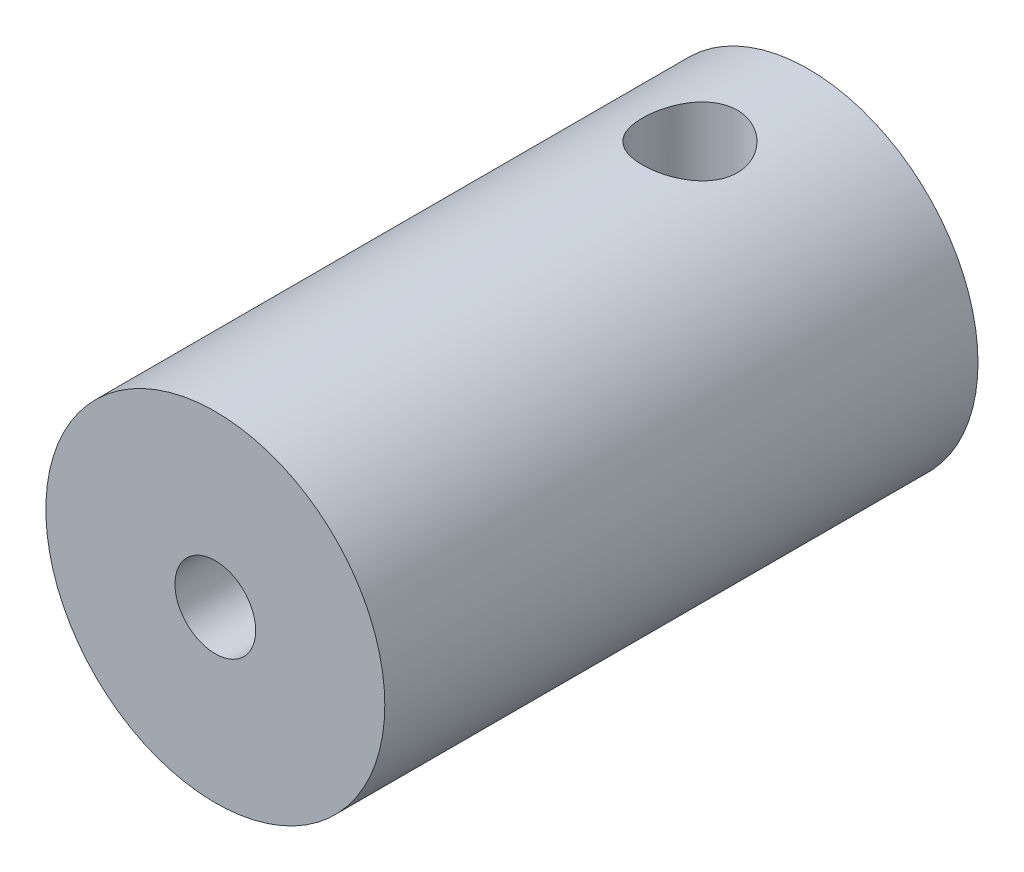
ISO-10303-21;
HEADER;
FILE_DESCRIPTION(('STEP AP214'),'2;1');
FILE_NAME('part.step','',(''),(''),'','','');
FILE_SCHEMA(('AUTOMOTIVE_DESIGN { 1 0 10303 214 1 1 1 1 }'));
ENDSEC;
DATA;
#1=APPLICATION_CONTEXT('core data for automotive mechanical design processes');
#2=APPLICATION_PROTOCOL_DEFINITION('international standard','automotive_design',2000,#1);
#3=PRODUCT_CONTEXT('',#1,'mechanical');
#4=PRODUCT('Part','Part','',(#3));
#5=PRODUCT_RELATED_PRODUCT_CATEGORY('part','',(#4));
#6=PRODUCT_DEFINITION_FORMATION('','',#4);
#7=PRODUCT_DEFINITION_CONTEXT('part definition',#1,'design');
#8=PRODUCT_DEFINITION('design','',#6,#7);
#9=PRODUCT_DEFINITION_SHAPE('','',#8);
#10=(LENGTH_UNIT() NAMED_UNIT(*) SI_UNIT(.MILLI.,.METRE.));
#11=(NAMED_UNIT(*) PLANE_ANGLE_UNIT() SI_UNIT($,.RADIAN.));
#12=(NAMED_UNIT(*) SI_UNIT($,.STERADIAN.) SOLID_ANGLE_UNIT());
#13=UNCERTAINTY_MEASURE_WITH_UNIT(LENGTH_MEASURE(1.E-05),#10,'distance_accuracy_value','');
#14=(GEOMETRIC_REPRESENTATION_CONTEXT(3) GLOBAL_UNCERTAINTY_ASSIGNED_CONTEXT((#13)) GLOBAL_UNIT_ASSIGNED_CONTEXT((#10,
#11,#12)) REPRESENTATION_CONTEXT('',''));
#15=CARTESIAN_POINT('',(0.,0.,0.));
#16=DIRECTION('',(0.,0.,1.));
#17=DIRECTION('',(1.,0.,0.));
#18=AXIS2_PLACEMENT_3D('',#15,#16,#17);
#19=CARTESIAN_POINT('',(0.,0.,35.));
#20=DIRECTION('',(0.,0.,-1.));
#21=DIRECTION('',(-1.,0.,0.));
#22=AXIS2_PLACEMENT_3D('',#19,#20,#21);
#23=CYLINDRICAL_SURFACE('',#22,10.);
#24=CARTESIAN_POINT('',(0.,0.,35.));
#25=DIRECTION('',(0.,0.,1.));
#26=DIRECTION('',(1.,0.,0.));
#27=AXIS2_PLACEMENT_3D('',#24,#25,#26);
#28=CIRCLE('',#27,10.);
#29=CARTESIAN_POINT('',(10.,0.,35.));
#30=VERTEX_POINT('',#29);
#31=EDGE_CURVE('E10',#30,#30,#28,.T.);
#32=ORIENTED_EDGE('',*,*,#31,.F.);
#33=EDGE_LOOP('',(#32));
#34=FACE_BOUND('',#33,.T.);
#35=CARTESIAN_POINT('',(0.,0.,0.));
#36=DIRECTION('',(0.,0.,1.));
#37=DIRECTION('',(1.,0.,0.));
#38=AXIS2_PLACEMENT_3D('',#35,#36,#37);
#39=CIRCLE('',#38,10.);
#40=CARTESIAN_POINT('',(10.,0.,0.));
#41=VERTEX_POINT('',#40);
#42=EDGE_CURVE('E44',#41,#41,#39,.T.);
#43=ORIENTED_EDGE('',*,*,#42,.T.);
#44=EDGE_LOOP('',(#43));
#45=FACE_BOUND('',#44,.T.);
#46=CARTESIAN_POINT('',(0.,10.,4.2));
#47=CARTESIAN_POINT('',(-0.154065429145943,9.99999800059393,4.2000030212422));
#48=CARTESIAN_POINT('',(-0.308162273480088,9.99640491810827,4.2127582688197));
#49=CARTESIAN_POINT('',(-0.611897994179671,9.98242110182319,4.2633401101412));
#50=CARTESIAN_POINT('',(-0.761535017440555,9.97202758242962,4.30117697789887));
#51=CARTESIAN_POINT('',(-1.05192431759401,9.94558686401861,4.40058130651125));
#52=CARTESIAN_POINT('',(-1.19268839590718,9.92954736983413,4.46211643801771));
#53=CARTESIAN_POINT('',(-1.46189968721869,9.893498867188,4.60704569090036));
#54=CARTESIAN_POINT('',(-1.59034575050753,9.8734894887286,4.69044184998216));
#55=CARTESIAN_POINT('',(-1.83453015519062,9.83108443801059,4.87895581158683));
#56=CARTESIAN_POINT('',(-1.94991193977893,9.80864475601135,4.98452556254727));
#57=CARTESIAN_POINT('',(-2.16158659967106,9.76418283149685,5.21342502148276));
#58=CARTESIAN_POINT('',(-2.25787674126981,9.74216064917047,5.3367572684857));
#59=CARTESIAN_POINT('',(-2.43042605891346,9.70057117196296,5.60059265089508));
#60=CARTESIAN_POINT('',(-2.50626541586478,9.68105909136695,5.74137985967721));
#61=CARTESIAN_POINT('',(-2.63305257665218,9.64735032587816,6.03434259979042));
#62=CARTESIAN_POINT('',(-2.6840054980816,9.6331525483039,6.18651578230571));
#63=CARTESIAN_POINT('',(-2.75831670498487,9.6121359460678,6.49395977138305));
#64=CARTESIAN_POINT('',(-2.78232578099845,9.60514344626391,6.64906110498407));
#65=CARTESIAN_POINT('',(-2.80409806651587,9.59881105772509,6.96123567419772));
#66=CARTESIAN_POINT('',(-2.8018667304816,9.5994695786108,7.11830849322694));
#67=CARTESIAN_POINT('',(-2.77173604959393,9.60820996637126,7.42480741493447));
#68=CARTESIAN_POINT('',(-2.74463468496829,9.61606103976332,7.57431960849052));
#69=CARTESIAN_POINT('',(-2.66681565074885,9.63793089210428,7.86658471349627));
#70=CARTESIAN_POINT('',(-2.61609592196964,9.65195020883037,8.00933703438542));
#71=CARTESIAN_POINT('',(-2.49185421192272,9.68477250963813,8.28606030645843));
#72=CARTESIAN_POINT('',(-2.41806066638955,9.70363195852586,8.41990235076579));
#73=CARTESIAN_POINT('',(-2.24995518133247,9.74398044101338,8.67357919110111));
#74=CARTESIAN_POINT('',(-2.15563883413612,9.76547003905462,8.79341096963866));
#75=CARTESIAN_POINT('',(-1.945130070486,9.80960868726074,9.02021252316115));
#76=CARTESIAN_POINT('',(-1.82827049780276,9.83227157921973,9.12656132230944));
#77=CARTESIAN_POINT('',(-1.57809559669089,9.87551038706931,9.31828626003981));
#78=CARTESIAN_POINT('',(-1.44477948172922,9.89608620312336,9.40366139561149));
#79=CARTESIAN_POINT('',(-1.1644499337768,9.93298140267101,9.55132825584314));
#80=CARTESIAN_POINT('',(-1.01736897822638,9.94927813215491,9.61349783024306));
#81=CARTESIAN_POINT('',(-0.714280244959805,9.97561561888343,9.71204354832863));
#82=CARTESIAN_POINT('',(-0.558274634899474,9.98565788825178,9.748425926808));
#83=CARTESIAN_POINT('',(-0.247056535331409,9.99812219608934,9.79336683078308));
#84=CARTESIAN_POINT('',(-0.0919748653162632,10.0007750839573,9.80276854472296));
#85=CARTESIAN_POINT('',(0.217552852424549,9.9988306664298,9.79582325772551));
#86=CARTESIAN_POINT('',(0.37199897110296,9.99423419364951,9.77947921378109));
#87=CARTESIAN_POINT('',(0.672795024976543,9.97845749111538,9.72219453001657));
#88=CARTESIAN_POINT('',(0.819243531299092,9.96740554981394,9.68173286344975));
#89=CARTESIAN_POINT('',(1.10325343945893,9.9399801500939,9.57792543335633));
#90=CARTESIAN_POINT('',(1.24081382962005,9.92360608716766,9.51457707017692));
#91=CARTESIAN_POINT('',(1.50635211550847,9.88682267587594,9.3652886467026));
#92=CARTESIAN_POINT('',(1.63406753404635,9.86633568099167,9.27890134426308));
#93=CARTESIAN_POINT('',(1.87348211388076,9.82368959784004,9.08654198621789));
#94=CARTESIAN_POINT('',(1.98517776842875,9.80153014508466,8.98056565413147));
#95=CARTESIAN_POINT('',(2.19299877746055,9.75717259135678,8.74808872546741));
#96=CARTESIAN_POINT('',(2.28852691021664,9.73499501664591,8.62104926995609));
#97=CARTESIAN_POINT('',(2.45693306834241,9.69386520723045,8.35226699177442));
#98=CARTESIAN_POINT('',(2.52981194004495,9.67491285202136,8.21052471876694));
#99=CARTESIAN_POINT('',(2.65031136361148,9.64260050746764,7.91699106844506));
#100=CARTESIAN_POINT('',(2.69807050435179,9.62920992117953,7.76526013881482));
#101=CARTESIAN_POINT('',(2.76725693285146,9.60955812642637,7.45547571023357));
#102=CARTESIAN_POINT('',(2.78869180791185,9.60329486372953,7.29742404664133));
#103=CARTESIAN_POINT('',(2.80415287354236,9.59879067310822,6.98563248418183));
#104=CARTESIAN_POINT('',(2.79914395120439,9.60026731543518,6.83194383242856));
#105=CARTESIAN_POINT('',(2.76412298746076,9.61040838766261,6.52769613663361));
#106=CARTESIAN_POINT('',(2.73411171950601,9.61907259521476,6.37713699592775));
#107=CARTESIAN_POINT('',(2.65052304211041,9.64243588913118,6.08477640847671));
#108=CARTESIAN_POINT('',(2.59716983425416,9.65707747485842,5.94290593592202));
#109=CARTESIAN_POINT('',(2.46858515169321,9.69074220682432,5.67001919603522));
#110=CARTESIAN_POINT('',(2.39334993497019,9.70976610236115,5.53900479011505));
#111=CARTESIAN_POINT('',(2.22029618025219,9.75081652103138,5.28699254425231));
#112=CARTESIAN_POINT('',(2.12182874405365,9.77291997619129,5.1664527896915));
#113=CARTESIAN_POINT('',(1.9063140615188,9.81723228272495,4.9432945782957));
#114=CARTESIAN_POINT('',(1.78926219581492,9.83944115896734,4.84068059046402));
#115=CARTESIAN_POINT('',(1.53646884760777,9.88210851159388,4.65381976071206));
#116=CARTESIAN_POINT('',(1.40034211759354,9.90251129390519,4.57008020629512));
#117=CARTESIAN_POINT('',(1.1153725237224,9.93863736051014,4.42680277778135));
#118=CARTESIAN_POINT('',(0.966537045967038,9.9543633393733,4.36725096050618));
#119=CARTESIAN_POINT('',(0.682104363429536,9.97758196529894,4.28088134576072));
#120=CARTESIAN_POINT('',(0.547611032656707,9.98592437500941,4.25062565920966));
#121=CARTESIAN_POINT('',(0.275419906644087,9.9971339513614,4.21018486269848));
#122=CARTESIAN_POINT('',(0.137722505211398,10.0000017873134,4.19999729924457));
#123=CARTESIAN_POINT('',(0.,10.,4.2));
#124=B_SPLINE_CURVE_WITH_KNOTS('',3,(#46,#47,#48,#49,#50,#51,#52,#53,#54,#55,#56,#57,#58,#59,
#60,#61,#62,#63,#64,#65,#66,#67,#68,#69,#70,#71,#72,#73,#74,#75,#76,#77,#78,#79,#80,#81,#82,#83,
#84,#85,#86,#87,#88,#89,#90,#91,#92,#93,#94,#95,#96,#97,#98,#99,#100,#101,#102,#103,#104,#105,
#106,#107,#108,#109,#110,#111,#112,#113,#114,#115,#116,#117,#118,#119,#120,#121,#122,#123),
.UNSPECIFIED.,.T.,.F.,(4,2,2,2,2,2,2,2,2,2,2,2,2,2,2,2,2,2,2,2,2,2,2,2,2,2,2,2,2,2,2,2,2,2,2,2,
2,2,4),(0.,0.461690909448976,0.923571055168943,1.38482331988189,1.8461185940435,
2.31793262655097,2.78981416872328,3.27075043019849,3.7515877512876,4.22054285105604,
4.68940047322025,5.14372119008822,5.59808152467874,6.05800456590497,6.51802648225273,
6.9946656987605,7.47132770485221,7.95046453500221,8.42948548053716,8.89336402152881,
9.35718928828607,9.81209635718982,10.2670551143061,10.7315851988714,11.1962168150222,
11.6754005477491,12.1545663727079,12.6310600864053,13.1074164306347,13.5665142712737,
14.0255979101868,14.4803656290683,14.9352111630499,15.404695598779,15.8742969133284,
16.3553170460189,16.8360594966302,17.2488257108794,17.661541457917),.UNSPECIFIED.);
#125=CARTESIAN_POINT('',(0.,10.,4.2));
#126=VERTEX_POINT('',#125);
#127=EDGE_CURVE('E61',#126,#126,#124,.T.);
#128=ORIENTED_EDGE('',*,*,#127,.F.);
#129=EDGE_LOOP('',(#128));
#130=FACE_BOUND('',#129,.T.);
#131=ADVANCED_FACE('F31',(#34,#45,#130),#23,.T.);
#132=CARTESIAN_POINT('',(0.,0.,12.));
#133=DIRECTION('',(0.,0.,-1.));
#134=DIRECTION('',(1.,0.,0.));
#135=AXIS2_PLACEMENT_3D('',#132,#133,#134);
#136=CONICAL_SURFACE('',#135,2.9,0.0174532925199433);
#137=CARTESIAN_POINT('',(0.,0.,0.));
#138=DIRECTION('',(0.,0.,1.));
#139=DIRECTION('',(1.,0.,0.));
#140=AXIS2_PLACEMENT_3D('',#137,#138,#139);
#141=CIRCLE('',#140,3.10946077913861);
#142=CARTESIAN_POINT('',(3.10946077913861,0.,0.));
#143=VERTEX_POINT('',#142);
#144=EDGE_CURVE('E49',#143,#143,#141,.F.);
#145=ORIENTED_EDGE('',*,*,#144,.T.);
#146=EDGE_LOOP('',(#145));
#147=FACE_BOUND('',#146,.T.);
#148=CARTESIAN_POINT('',(0.,0.,12.));
#149=DIRECTION('',(0.,0.,1.));
#150=DIRECTION('',(1.,0.,0.));
#151=AXIS2_PLACEMENT_3D('',#148,#149,#150);
#152=CIRCLE('',#151,2.9);
#153=CARTESIAN_POINT('',(2.9,0.,12.));
#154=VERTEX_POINT('',#153);
#155=EDGE_CURVE('E55',#154,#154,#152,.T.);
#156=ORIENTED_EDGE('',*,*,#155,.T.);
#157=EDGE_LOOP('',(#156));
#158=FACE_BOUND('',#157,.T.);
#159=CARTESIAN_POINT('',(-2.64702329686597,1.41863718826168,6.0871650390959));
#160=CARTESIAN_POINT('',(-2.61444310214904,1.48291245124853,5.99267898101919));
#161=CARTESIAN_POINT('',(-2.57738410387842,1.54987077266653,5.90152574855468));
#162=CARTESIAN_POINT('',(-2.49453730896087,1.68551559971198,5.72452961206376));
#163=CARTESIAN_POINT('',(-2.44873877804809,1.75420413946054,5.63869341219463));
#164=CARTESIAN_POINT('',(-2.34813884172101,1.89140441368313,5.47167595894754));
#165=CARTESIAN_POINT('',(-2.29330685102101,1.9599147153286,5.39051182938401));
#166=CARTESIAN_POINT('',(-2.17456910662341,2.09483247043135,5.23338324926096));
#167=CARTESIAN_POINT('',(-2.11067046605465,2.16124152291537,5.15741479109479));
#168=CARTESIAN_POINT('',(-1.94482727758248,2.31757307195905,4.98063059424191));
#169=CARTESIAN_POINT('',(-1.83812406642259,2.40576289265858,4.88265150922485));
#170=CARTESIAN_POINT('',(-1.60549481961238,2.57055624567929,4.7012994136489));
#171=CARTESIAN_POINT('',(-1.47962721357173,2.64719363225789,4.61788360727464));
#172=CARTESIAN_POINT('',(-1.2381216717063,2.76932862046972,4.48569580812681));
#173=CARTESIAN_POINT('',(-1.12606575262591,2.81798018463067,4.43333031964479));
#174=CARTESIAN_POINT('',(-0.891676017746685,2.90232057099488,4.34280921389622));
#175=CARTESIAN_POINT('',(-0.769345632416317,2.93801369877961,4.30464887670666));
#176=CARTESIAN_POINT('',(-0.516184758224972,2.9939785597068,4.24490047814209));
#177=CARTESIAN_POINT('',(-0.385297092841551,3.01413188938249,4.2234396453592));
#178=CARTESIAN_POINT('',(-0.120307434386774,3.03668055238867,4.19943169231545));
#179=CARTESIAN_POINT('',(0.0137922560614811,3.03908824620692,4.19687140712636));
#180=CARTESIAN_POINT('',(0.26366013217813,3.02677017806333,4.20998307471404));
#181=CARTESIAN_POINT('',(0.379659157685303,3.01410990458006,4.22345705026334));
#182=CARTESIAN_POINT('',(0.607009114229356,2.97594286573936,4.26414912104814));
#183=CARTESIAN_POINT('',(0.718359258187159,2.95043393451378,4.29136953349035));
#184=CARTESIAN_POINT('',(0.936494538751471,2.88748384665746,4.35872706482328));
#185=CARTESIAN_POINT('',(1.04311385937753,2.84977962026002,4.399149169901));
#186=CARTESIAN_POINT('',(1.2474285333388,2.76470688674716,4.49072210720284));
#187=CARTESIAN_POINT('',(1.34512132602445,2.71733561908151,4.54187600414798));
#188=CARTESIAN_POINT('',(1.57839479805393,2.58874210738376,4.68150259434139));
#189=CARTESIAN_POINT('',(1.707843552381,2.50258765207947,4.77569193991843));
#190=CARTESIAN_POINT('',(1.94485423938854,2.31860300921537,4.97957017990121));
#191=CARTESIAN_POINT('',(2.05233576099829,2.22073193423618,5.08931361357279));
#192=CARTESIAN_POINT('',(2.21030646502859,2.05587536176602,5.27847357133978));
#193=CARTESIAN_POINT('',(2.26723816572946,1.99073157384588,5.35424551077735));
#194=CARTESIAN_POINT('',(2.37281952808308,1.85920918281383,5.51049299849724));
#195=CARTESIAN_POINT('',(2.42146302823831,1.79282970139195,5.59097198684253));
#196=CARTESIAN_POINT('',(2.51045735544197,1.66069236568045,5.75645165066087));
#197=CARTESIAN_POINT('',(2.55082954203184,1.59493333952033,5.84143994738495));
#198=CARTESIAN_POINT('',(2.62340553513994,1.46622069861454,6.01676376748599));
#199=CARTESIAN_POINT('',(2.65562016292643,1.4032634596159,6.10709200884566));
#200=CARTESIAN_POINT('',(2.70296187676171,1.30253734839971,6.26610019314931));
#201=CARTESIAN_POINT('',(2.72030214351711,1.26295161561822,6.33295734774533));
#202=CARTESIAN_POINT('',(2.75046272573288,1.18978220499674,6.47091065734508));
#203=CARTESIAN_POINT('',(2.76328775676663,1.15619228350443,6.54200229868421));
#204=CARTESIAN_POINT('',(2.78154133735745,1.10520755838302,6.67370495169725));
#205=CARTESIAN_POINT('',(2.78795459363836,1.08589622388069,6.73340997511623));
#206=CARTESIAN_POINT('',(2.79692008748258,1.05659517145625,6.85528121639306));
#207=CARTESIAN_POINT('',(2.79948462143514,1.04657580573292,6.91743894198681));
#208=CARTESIAN_POINT('',(2.80037666993664,1.0378978892437,7.04314551303535));
#209=CARTESIAN_POINT('',(2.79866928292904,1.03933313196544,7.10670158493223));
#210=CARTESIAN_POINT('',(2.79105751893917,1.05339915536237,7.23234764394863));
#211=CARTESIAN_POINT('',(2.78514357336756,1.06605547664617,7.2944339545141));
#212=CARTESIAN_POINT('',(2.76655048029884,1.10672695485929,7.43994105544362));
#213=CARTESIAN_POINT('',(2.75210881573937,1.13886750300799,7.52192441779209));
#214=CARTESIAN_POINT('',(2.71734357554773,1.21273992611142,7.68019492496164));
#215=CARTESIAN_POINT('',(2.69699395071622,1.25451410587121,7.75645491860576));
#216=CARTESIAN_POINT('',(2.64891797424704,1.34731459369108,7.9112612273953));
#217=CARTESIAN_POINT('',(2.62067521449725,1.39884256869732,7.98933901272256));
#218=CARTESIAN_POINT('',(2.55824802808286,1.50478319147049,8.14109616437511));
#219=CARTESIAN_POINT('',(2.52405763719464,1.5591986963896,8.2147710148822));
#220=CARTESIAN_POINT('',(2.44974819335895,1.66908787971264,8.35840903253475));
#221=CARTESIAN_POINT('',(2.40962152055473,1.72456283712872,8.42836726977802));
#222=CARTESIAN_POINT('',(2.32339241987438,1.83525296249583,8.56472127660673));
#223=CARTESIAN_POINT('',(2.27728968883999,1.89046811712002,8.63111686522153));
#224=CARTESIAN_POINT('',(2.17414384358067,2.00502733104679,8.76664750816342));
#225=CARTESIAN_POINT('',(2.11647124042843,2.06424537750443,8.83541281564692));
#226=CARTESIAN_POINT('',(1.99352220928445,2.1800773859197,8.96826354328187));
#227=CARTESIAN_POINT('',(1.92824328574285,2.2366904846769,9.03234741622348));
#228=CARTESIAN_POINT('',(1.79015176981594,2.34597026035759,9.15495939519641));
#229=CARTESIAN_POINT('',(1.71736584988254,2.39864983597114,9.21350584456458));
#230=CARTESIAN_POINT('',(1.56404801869896,2.49904115324173,9.32437064397424));
#231=CARTESIAN_POINT('',(1.48351847146155,2.54675440183888,9.37669088393839));
#232=CARTESIAN_POINT('',(1.29439724948235,2.64670256209791,9.48579183372681));
#233=CARTESIAN_POINT('',(1.18372992018601,2.69723871773293,9.54058933285749));
#234=CARTESIAN_POINT('',(0.951736138696839,2.78577666672618,9.63626152428189));
#235=CARTESIAN_POINT('',(0.830417084726792,2.82378707405757,9.67714578536248));
#236=CARTESIAN_POINT('',(0.641992004142349,2.86947242298232,9.72619372622781));
#237=CARTESIAN_POINT('',(0.577797842332922,2.88284758026429,9.74053394029508));
#238=CARTESIAN_POINT('',(0.447865479016121,2.90543861540936,9.76473760248953));
#239=CARTESIAN_POINT('',(0.382128069099467,2.91465657864782,9.77460329518724));
#240=CARTESIAN_POINT('',(0.249670731287265,2.92871326476322,9.78964241136202));
#241=CARTESIAN_POINT('',(0.182951102293708,2.93355329300766,9.79481723351547));
#242=CARTESIAN_POINT('',(0.049160597091577,2.93874749825238,9.8003703555789));
#243=CARTESIAN_POINT('',(-0.0179102397812443,2.93910216730486,9.80074918161851));
#244=CARTESIAN_POINT('',(-0.202793778744688,2.93384371861617,9.79512834888441));
#245=CARTESIAN_POINT('',(-0.320386616518409,2.92348469583332,9.78405632123675));
#246=CARTESIAN_POINT('',(-0.551280527391157,2.88951850709387,9.74768810553325));
#247=CARTESIAN_POINT('',(-0.66458093924253,2.86590930873696,9.72238973534493));
#248=CARTESIAN_POINT('',(-0.885198745303283,2.80682158540267,9.65889112777122));
#249=CARTESIAN_POINT('',(-0.992463386283698,2.77125311641187,9.62059310033606));
#250=CARTESIAN_POINT('',(-1.19839105638855,2.69030296207377,9.53306160572915));
#251=CARTESIAN_POINT('',(-1.29705190219456,2.6449187959825,9.48382537403392));
#252=CARTESIAN_POINT('',(-1.53135074913383,2.52200467872427,9.34970168902912));
#253=CARTESIAN_POINT('',(-1.66125425780442,2.43965425864056,9.25920175376676));
#254=CARTESIAN_POINT('',(-1.89998746858749,2.26322843927361,9.06255231004254));
#255=CARTESIAN_POINT('',(-2.00874043833041,2.16911231070476,8.95634819290329));
#256=CARTESIAN_POINT('',(-2.16945621120155,2.01023637639495,8.7726840781573));
#257=CARTESIAN_POINT('',(-2.22763791777394,1.94733643055607,8.69892651257827));
#258=CARTESIAN_POINT('',(-2.33597541490252,1.82028501458491,8.54659861701925));
#259=CARTESIAN_POINT('',(-2.38612507038652,1.75613262937299,8.46802467091517));
#260=CARTESIAN_POINT('',(-2.47839477207151,1.62845242042462,8.30622238493941));
#261=CARTESIAN_POINT('',(-2.52053488274927,1.56492342446363,8.22300636948532));
#262=CARTESIAN_POINT('',(-2.59693456439273,1.44074196572033,8.05108826799132));
#263=CARTESIAN_POINT('',(-2.63120488590409,1.38008566973706,7.9623938785621));
#264=CARTESIAN_POINT('',(-2.68241881754946,1.28322009577695,7.8057333968321));
#265=CARTESIAN_POINT('',(-2.70146801204393,1.24516529568626,7.73961112464258));
#266=CARTESIAN_POINT('',(-2.73519051132427,1.17526988696731,7.60305194246003));
#267=CARTESIAN_POINT('',(-2.74986946622161,1.14342127318128,7.53262074665575));
#268=CARTESIAN_POINT('',(-2.77154990823956,1.09588053656622,7.40235428679534));
#269=CARTESIAN_POINT('',(-2.77951909626255,1.07819499097757,7.34343561359873));
#270=CARTESIAN_POINT('',(-2.79173250568138,1.05213588335617,7.22327041651017));
#271=CARTESIAN_POINT('',(-2.79598855887081,1.04373272033839,7.16203194028588));
#272=CARTESIAN_POINT('',(-2.80042168540011,1.03800825179805,7.03844856802007));
#273=CARTESIAN_POINT('',(-2.80057195857725,1.04075962295105,6.97609905958703));
#274=CARTESIAN_POINT('',(-2.79681456160731,1.05690777761022,6.85283289575024));
#275=CARTESIAN_POINT('',(-2.7928946260668,1.07033670882527,6.7919211402428));
#276=CARTESIAN_POINT('',(-2.77889811995715,1.11318166201277,6.64605748303053));
#277=CARTESIAN_POINT('',(-2.76684038569119,1.14707912018966,6.56267473684909));
#278=CARTESIAN_POINT('',(-2.73658399968006,1.22439403187281,6.40179632890315));
#279=CARTESIAN_POINT('',(-2.71837253500414,1.26783128196308,6.3243133671949));
#280=CARTESIAN_POINT('',(-2.68976867744675,1.33066674238944,6.22156629314785));
#281=CARTESIAN_POINT('',(-2.68171365903506,1.34789773049875,6.19426325882044));
#282=CARTESIAN_POINT('',(-2.66489635368839,1.38289539654368,6.14027543218981));
#283=CARTESIAN_POINT('',(-2.65613498001348,1.40066136473922,6.11358989722005));
#284=CARTESIAN_POINT('',(-2.64702329686597,1.41863718826168,6.0871650390959));
#285=B_SPLINE_CURVE_WITH_KNOTS('',3,(#159,#160,#161,#162,#163,#164,#165,#166,#167,#168,#169,
#170,#171,#172,#173,#174,#175,#176,#177,#178,#179,#180,#181,#182,#183,#184,#185,#186,#187,#188,
#189,#190,#191,#192,#193,#194,#195,#196,#197,#198,#199,#200,#201,#202,#203,#204,#205,#206,#207,
#208,#209,#210,#211,#212,#213,#214,#215,#216,#217,#218,#219,#220,#221,#222,#223,#224,#225,#226,
#227,#228,#229,#230,#231,#232,#233,#234,#235,#236,#237,#238,#239,#240,#241,#242,#243,#244,#245,
#246,#247,#248,#249,#250,#251,#252,#253,#254,#255,#256,#257,#258,#259,#260,#261,#262,#263,#264,
#265,#266,#267,#268,#269,#270,#271,#272,#273,#274,#275,#276,#277,#278,#279,#280,#281,#282,#283,
#284),.UNSPECIFIED.,.T.,.F.,(4,2,2,2,2,2,2,2,2,2,2,2,2,2,2,2,2,2,2,2,2,2,2,2,2,2,2,2,2,2,2,2,2,
2,2,2,2,2,2,2,2,2,2,2,2,2,2,2,2,2,2,2,2,2,2,2,2,2,2,2,2,2,4),(0.,0.356450766977531,
0.71334219318815,1.07146779077941,1.42931396305963,1.93626939479032,2.44170904440443,
2.83890434733864,3.23596755677054,3.63602703455207,4.03580782984257,4.38654852360265,
4.73734836069693,5.09628584229129,5.45532596697739,5.99773700657112,6.54209932003802,
6.88675300947438,7.23166180908226,7.57566837883644,7.91921619346025,8.15774886841393,
8.39603168299158,8.5846240032917,8.77261249239434,8.96214185264712,9.15210371661417,
9.41830041215271,9.68568911765104,9.97842454762291,10.2714552399507,10.5648653858266,
10.8582904218759,11.1804868495845,11.5027892856251,11.8239836413794,12.1450802507746,
12.5438601014014,12.9423651355039,13.1434825714465,13.3444990082252,13.5454554882199,
13.7463899227263,14.1002052947509,14.4540749521754,14.8106678678052,15.1673510115246,
15.6997890613946,16.2341241221039,16.5729350774157,16.9120036029703,17.2502112078258,
17.5879540178907,17.8235497426027,18.0588395387754,18.244278825264,18.4291250338692,
18.6151775256085,18.8017923099818,19.0727015227105,19.3441783182782,19.443993731437,
19.5436820996191),.UNSPECIFIED.);
#286=CARTESIAN_POINT('',(-2.64702329686597,1.41863718826168,6.0871650390959));
#287=VERTEX_POINT('',#286);
#288=EDGE_CURVE('E35',#287,#287,#285,.T.);
#289=ORIENTED_EDGE('',*,*,#288,.F.);
#290=EDGE_LOOP('',(#289));
#291=FACE_BOUND('',#290,.T.);
#292=ADVANCED_FACE('F82',(#147,#158,#291),#136,.F.);
#293=CARTESIAN_POINT('',(0.,0.,35.));
#294=DIRECTION('',(0.,0.,1.));
#295=DIRECTION('',(1.,0.,0.));
#296=AXIS2_PLACEMENT_3D('',#293,#294,#295);
#297=PLANE('',#296);
#298=CARTESIAN_POINT('',(0.,0.,35.));
#299=DIRECTION('',(0.,0.,1.));
#300=DIRECTION('',(1.,0.,0.));
#301=AXIS2_PLACEMENT_3D('',#298,#299,#300);
#302=CIRCLE('',#301,2.38125);
#303=CARTESIAN_POINT('',(2.38125,0.,35.));
#304=VERTEX_POINT('',#303);
#305=EDGE_CURVE('E56',#304,#304,#302,.T.);
#306=ORIENTED_EDGE('',*,*,#305,.F.);
#307=EDGE_LOOP('',(#306));
#308=FACE_BOUND('',#307,.T.);
#309=ORIENTED_EDGE('',*,*,#31,.T.);
#310=EDGE_LOOP('',(#309));
#311=FACE_BOUND('',#310,.T.);
#312=ADVANCED_FACE('F86',(#308,#311),#297,.T.);
#313=CARTESIAN_POINT('',(0.,0.,0.));
#314=DIRECTION('',(0.,0.,1.));
#315=DIRECTION('',(1.,0.,0.));
#316=AXIS2_PLACEMENT_3D('',#313,#314,#315);
#317=PLANE('',#316);
#318=ORIENTED_EDGE('',*,*,#144,.F.);
#319=EDGE_LOOP('',(#318));
#320=FACE_BOUND('',#319,.T.);
#321=ORIENTED_EDGE('',*,*,#42,.F.);
#322=EDGE_LOOP('',(#321));
#323=FACE_BOUND('',#322,.T.);
#324=ADVANCED_FACE('F81',(#320,#323),#317,.F.);
#325=CARTESIAN_POINT('',(0.,0.,12.));
#326=DIRECTION('',(0.,0.,1.));
#327=DIRECTION('',(1.,0.,0.));
#328=AXIS2_PLACEMENT_3D('',#325,#326,#327);
#329=PLANE('',#328);
#330=CARTESIAN_POINT('',(0.,0.,12.));
#331=DIRECTION('',(0.,0.,1.));
#332=DIRECTION('',(1.,0.,0.));
#333=AXIS2_PLACEMENT_3D('',#330,#331,#332);
#334=CIRCLE('',#333,2.38125);
#335=CARTESIAN_POINT('',(2.38125,0.,12.));
#336=VERTEX_POINT('',#335);
#337=EDGE_CURVE('E53',#336,#336,#334,.T.);
#338=ORIENTED_EDGE('',*,*,#337,.T.);
#339=EDGE_LOOP('',(#338));
#340=FACE_BOUND('',#339,.T.);
#341=ORIENTED_EDGE('',*,*,#155,.F.);
#342=EDGE_LOOP('',(#341));
#343=FACE_BOUND('',#342,.T.);
#344=ADVANCED_FACE('F79',(#340,#343),#329,.F.);
#345=CARTESIAN_POINT('',(0.,0.,0.));
#346=DIRECTION('',(0.,0.,1.));
#347=DIRECTION('',(1.,0.,0.));
#348=AXIS2_PLACEMENT_3D('',#345,#346,#347);
#349=CYLINDRICAL_SURFACE('',#348,2.38125);
#350=ORIENTED_EDGE('',*,*,#305,.T.);
#351=EDGE_LOOP('',(#350));
#352=FACE_BOUND('',#351,.T.);
#353=ORIENTED_EDGE('',*,*,#337,.F.);
#354=EDGE_LOOP('',(#353));
#355=FACE_BOUND('',#354,.T.);
#356=ADVANCED_FACE('F74',(#352,#355),#349,.F.);
#357=CARTESIAN_POINT('',(0.,10.,7.));
#358=DIRECTION('',(0.,-1.,0.));
#359=DIRECTION('',(0.,0.,-1.));
#360=AXIS2_PLACEMENT_3D('',#357,#358,#359);
#361=CYLINDRICAL_SURFACE('',#360,2.8);
#362=ORIENTED_EDGE('',*,*,#288,.T.);
#363=EDGE_LOOP('',(#362));
#364=FACE_BOUND('',#363,.T.);
#365=ORIENTED_EDGE('',*,*,#127,.T.);
#366=EDGE_LOOP('',(#365));
#367=FACE_BOUND('',#366,.T.);
#368=ADVANCED_FACE('F70',(#364,#367),#361,.F.);
#369=CLOSED_SHELL('',(#131,#292,#312,#324,#344,#356,#368));
#370=MANIFOLD_SOLID_BREP('B2',#369);
#371=ADVANCED_BREP_SHAPE_REPRESENTATION('',(#18,#370),#14);
#372=SHAPE_DEFINITION_REPRESENTATION(#9,#371);
ENDSEC;
END-ISO-10303-21;
